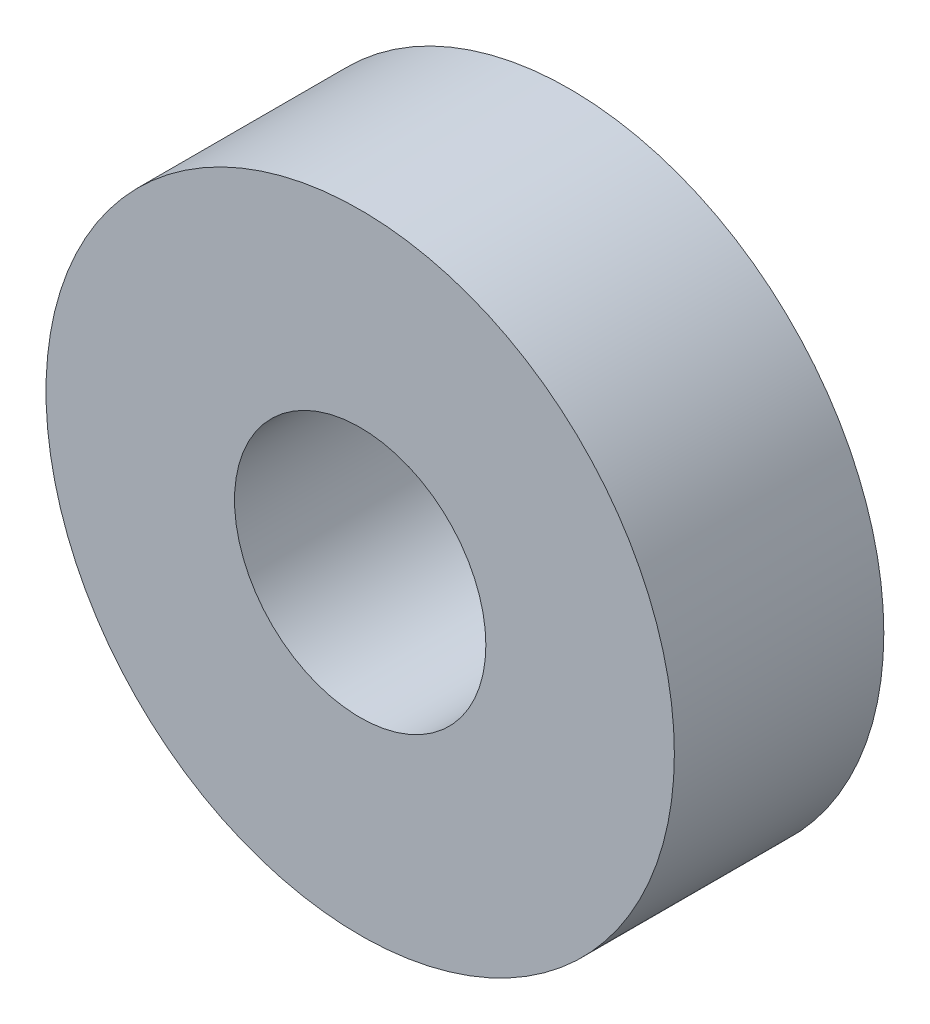
ISO-10303-21;
HEADER;
FILE_DESCRIPTION(('STEP AP214'),'2;1');
FILE_NAME('part.step','',(''),(''),'','','');
FILE_SCHEMA(('AUTOMOTIVE_DESIGN { 1 0 10303 214 1 1 1 1 }'));
ENDSEC;
DATA;
#1=APPLICATION_CONTEXT('core data for automotive mechanical design processes');
#2=APPLICATION_PROTOCOL_DEFINITION('international standard','automotive_design',2000,#1);
#3=PRODUCT_CONTEXT('',#1,'mechanical');
#4=PRODUCT('Part','Part','',(#3));
#5=PRODUCT_RELATED_PRODUCT_CATEGORY('part','',(#4));
#6=PRODUCT_DEFINITION_FORMATION('','',#4);
#7=PRODUCT_DEFINITION_CONTEXT('part definition',#1,'design');
#8=PRODUCT_DEFINITION('design','',#6,#7);
#9=PRODUCT_DEFINITION_SHAPE('','',#8);
#10=(LENGTH_UNIT() NAMED_UNIT(*) SI_UNIT(.MILLI.,.METRE.));
#11=(NAMED_UNIT(*) PLANE_ANGLE_UNIT() SI_UNIT($,.RADIAN.));
#12=(NAMED_UNIT(*) SI_UNIT($,.STERADIAN.) SOLID_ANGLE_UNIT());
#13=UNCERTAINTY_MEASURE_WITH_UNIT(LENGTH_MEASURE(1.E-05),#10,'distance_accuracy_value','');
#14=(GEOMETRIC_REPRESENTATION_CONTEXT(3) GLOBAL_UNCERTAINTY_ASSIGNED_CONTEXT((#13)) GLOBAL_UNIT_ASSIGNED_CONTEXT((#10,
#11,#12)) REPRESENTATION_CONTEXT('',''));
#15=CARTESIAN_POINT('',(0.,0.,0.));
#16=DIRECTION('',(0.,0.,1.));
#17=DIRECTION('',(1.,0.,0.));
#18=AXIS2_PLACEMENT_3D('',#15,#16,#17);
#19=CARTESIAN_POINT('',(0.,0.,10.));
#20=DIRECTION('',(0.,0.,1.));
#21=DIRECTION('',(1.,0.,0.));
#22=AXIS2_PLACEMENT_3D('',#19,#20,#21);
#23=PLANE('',#22);
#24=CARTESIAN_POINT('',(0.,0.,10.));
#25=DIRECTION('',(0.,0.,1.));
#26=DIRECTION('',(1.,0.,0.));
#27=AXIS2_PLACEMENT_3D('',#24,#25,#26);
#28=CIRCLE('',#27,15.);
#29=CARTESIAN_POINT('',(15.,0.,10.));
#30=VERTEX_POINT('',#29);
#31=EDGE_CURVE('E10',#30,#30,#28,.T.);
#32=ORIENTED_EDGE('',*,*,#31,.T.);
#33=EDGE_LOOP('',(#32));
#34=FACE_BOUND('',#33,.T.);
#35=CARTESIAN_POINT('',(0.,0.,10.));
#36=DIRECTION('',(0.,0.,1.));
#37=DIRECTION('',(1.,0.,0.));
#38=AXIS2_PLACEMENT_3D('',#35,#36,#37);
#39=CIRCLE('',#38,6.);
#40=CARTESIAN_POINT('',(6.,0.,10.));
#41=VERTEX_POINT('',#40);
#42=EDGE_CURVE('E43',#41,#41,#39,.T.);
#43=ORIENTED_EDGE('',*,*,#42,.F.);
#44=EDGE_LOOP('',(#43));
#45=FACE_BOUND('',#44,.T.);
#46=ADVANCED_FACE('F32',(#34,#45),#23,.T.);
#47=CARTESIAN_POINT('',(0.,0.,0.));
#48=DIRECTION('',(0.,0.,1.));
#49=DIRECTION('',(1.,0.,0.));
#50=AXIS2_PLACEMENT_3D('',#47,#48,#49);
#51=PLANE('',#50);
#52=CARTESIAN_POINT('',(0.,0.,0.));
#53=DIRECTION('',(0.,0.,1.));
#54=DIRECTION('',(1.,0.,0.));
#55=AXIS2_PLACEMENT_3D('',#52,#53,#54);
#56=CIRCLE('',#55,15.);
#57=CARTESIAN_POINT('',(15.,0.,0.));
#58=VERTEX_POINT('',#57);
#59=EDGE_CURVE('E36',#58,#58,#56,.T.);
#60=ORIENTED_EDGE('',*,*,#59,.F.);
#61=EDGE_LOOP('',(#60));
#62=FACE_BOUND('',#61,.T.);
#63=CARTESIAN_POINT('',(0.,0.,0.));
#64=DIRECTION('',(0.,0.,1.));
#65=DIRECTION('',(1.,0.,0.));
#66=AXIS2_PLACEMENT_3D('',#63,#64,#65);
#67=CIRCLE('',#66,6.);
#68=CARTESIAN_POINT('',(6.,0.,0.));
#69=VERTEX_POINT('',#68);
#70=EDGE_CURVE('E45',#69,#69,#67,.T.);
#71=ORIENTED_EDGE('',*,*,#70,.T.);
#72=EDGE_LOOP('',(#71));
#73=FACE_BOUND('',#72,.T.);
#74=ADVANCED_FACE('F55',(#62,#73),#51,.F.);
#75=CARTESIAN_POINT('',(0.,0.,10.));
#76=DIRECTION('',(0.,0.,-1.));
#77=DIRECTION('',(-1.,0.,0.));
#78=AXIS2_PLACEMENT_3D('',#75,#76,#77);
#79=CYLINDRICAL_SURFACE('',#78,15.);
#80=ORIENTED_EDGE('',*,*,#31,.F.);
#81=EDGE_LOOP('',(#80));
#82=FACE_BOUND('',#81,.T.);
#83=ORIENTED_EDGE('',*,*,#59,.T.);
#84=EDGE_LOOP('',(#83));
#85=FACE_BOUND('',#84,.T.);
#86=ADVANCED_FACE('F34',(#82,#85),#79,.T.);
#87=CARTESIAN_POINT('',(0.,0.,10.));
#88=DIRECTION('',(0.,0.,-1.));
#89=DIRECTION('',(-1.,0.,0.));
#90=AXIS2_PLACEMENT_3D('',#87,#88,#89);
#91=CYLINDRICAL_SURFACE('',#90,6.);
#92=ORIENTED_EDGE('',*,*,#42,.T.);
#93=EDGE_LOOP('',(#92));
#94=FACE_BOUND('',#93,.T.);
#95=ORIENTED_EDGE('',*,*,#70,.F.);
#96=EDGE_LOOP('',(#95));
#97=FACE_BOUND('',#96,.T.);
#98=ADVANCED_FACE('F51',(#94,#97),#91,.F.);
#99=CLOSED_SHELL('',(#46,#74,#86,#98));
#100=MANIFOLD_SOLID_BREP('B2',#99);
#101=ADVANCED_BREP_SHAPE_REPRESENTATION('',(#18,#100),#14);
#102=SHAPE_DEFINITION_REPRESENTATION(#9,#101);
ENDSEC;
END-ISO-10303-21;
